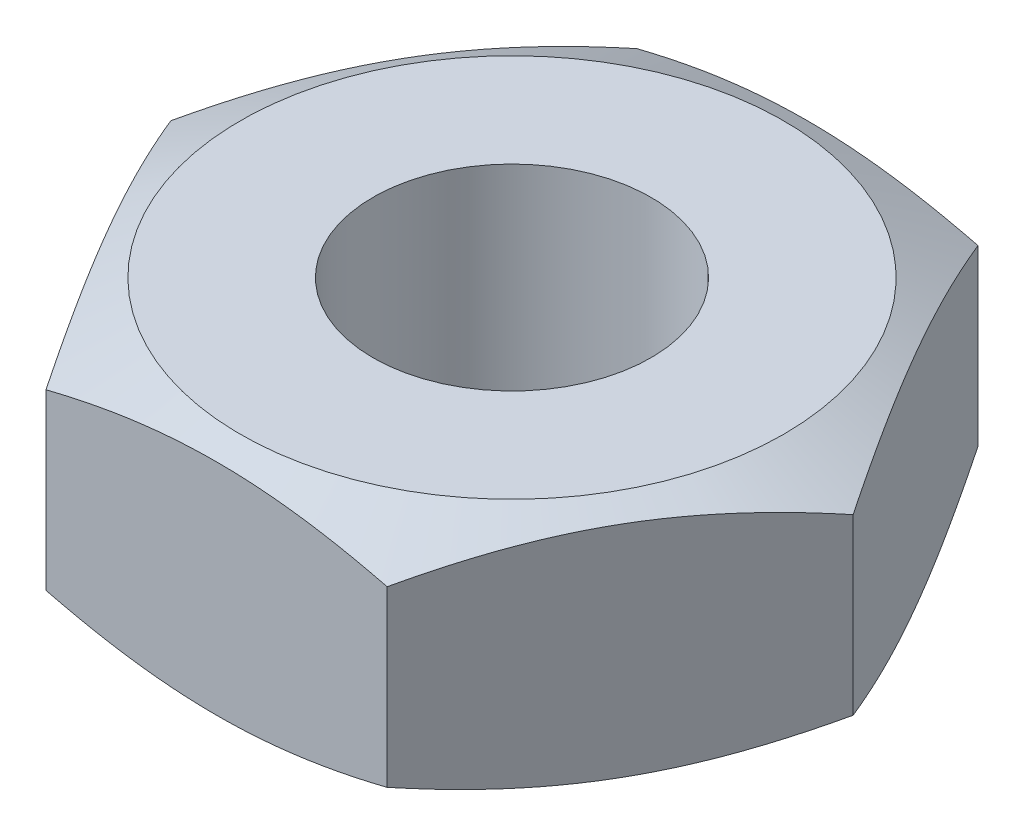
ISO-10303-21;
HEADER;
FILE_DESCRIPTION(('STEP AP214'),'2;1');
FILE_NAME('part.step','',(''),(''),'','','');
FILE_SCHEMA(('AUTOMOTIVE_DESIGN { 1 0 10303 214 1 1 1 1 }'));
ENDSEC;
DATA;
#1=APPLICATION_CONTEXT('core data for automotive mechanical design processes');
#2=APPLICATION_PROTOCOL_DEFINITION('international standard','automotive_design',2000,#1);
#3=PRODUCT_CONTEXT('',#1,'mechanical');
#4=PRODUCT('Part','Part','',(#3));
#5=PRODUCT_RELATED_PRODUCT_CATEGORY('part','',(#4));
#6=PRODUCT_DEFINITION_FORMATION('','',#4);
#7=PRODUCT_DEFINITION_CONTEXT('part definition',#1,'design');
#8=PRODUCT_DEFINITION('design','',#6,#7);
#9=PRODUCT_DEFINITION_SHAPE('','',#8);
#10=(LENGTH_UNIT() NAMED_UNIT(*) SI_UNIT(.MILLI.,.METRE.));
#11=(NAMED_UNIT(*) PLANE_ANGLE_UNIT() SI_UNIT($,.RADIAN.));
#12=(NAMED_UNIT(*) SI_UNIT($,.STERADIAN.) SOLID_ANGLE_UNIT());
#13=UNCERTAINTY_MEASURE_WITH_UNIT(LENGTH_MEASURE(1.E-05),#10,'distance_accuracy_value','');
#14=(GEOMETRIC_REPRESENTATION_CONTEXT(3) GLOBAL_UNCERTAINTY_ASSIGNED_CONTEXT((#13)) GLOBAL_UNIT_ASSIGNED_CONTEXT((#10,
#11,#12)) REPRESENTATION_CONTEXT('',''));
#15=CARTESIAN_POINT('',(0.,0.,0.));
#16=DIRECTION('',(0.,0.,1.));
#17=DIRECTION('',(1.,0.,0.));
#18=AXIS2_PLACEMENT_3D('',#15,#16,#17);
#19=CARTESIAN_POINT('',(0.,3.5,0.));
#20=DIRECTION('',(0.,1.,0.));
#21=DIRECTION('',(0.,0.,1.));
#22=AXIS2_PLACEMENT_3D('',#19,#20,#21);
#23=PLANE('',#22);
#24=CARTESIAN_POINT('',(0.,3.5,0.));
#25=DIRECTION('',(0.,1.,0.));
#26=DIRECTION('',(0.,0.,1.));
#27=AXIS2_PLACEMENT_3D('',#24,#25,#26);
#28=CIRCLE('',#27,2.);
#29=CARTESIAN_POINT('',(0.,3.5,2.));
#30=VERTEX_POINT('',#29);
#31=EDGE_CURVE('E114',#30,#30,#28,.T.);
#32=ORIENTED_EDGE('',*,*,#31,.F.);
#33=EDGE_LOOP('',(#32));
#34=FACE_BOUND('',#33,.T.);
#35=CARTESIAN_POINT('',(0.,3.50000000000006,0.));
#36=DIRECTION('',(0.,-1.,0.));
#37=DIRECTION('',(1.,0.,0.));
#38=AXIS2_PLACEMENT_3D('',#35,#36,#37);
#39=CIRCLE('',#38,3.90747728811183);
#40=CARTESIAN_POINT('',(3.90747728811182,3.50000000000007,0.));
#41=VERTEX_POINT('',#40);
#42=EDGE_CURVE('E107',#41,#41,#39,.T.);
#43=ORIENTED_EDGE('',*,*,#42,.F.);
#44=EDGE_LOOP('',(#43));
#45=FACE_BOUND('',#44,.T.);
#46=ADVANCED_FACE('F34',(#34,#45),#23,.T.);
#47=CARTESIAN_POINT('',(0.,0.,0.));
#48=DIRECTION('',(0.,1.,0.));
#49=DIRECTION('',(0.,0.,1.));
#50=AXIS2_PLACEMENT_3D('',#47,#48,#49);
#51=PLANE('',#50);
#52=CARTESIAN_POINT('',(0.,0.,0.));
#53=DIRECTION('',(0.,-1.,0.));
#54=DIRECTION('',(1.,0.,0.));
#55=AXIS2_PLACEMENT_3D('',#52,#53,#54);
#56=CIRCLE('',#55,3.90747728811182);
#57=CARTESIAN_POINT('',(3.90747728811182,0.,0.));
#58=VERTEX_POINT('',#57);
#59=EDGE_CURVE('E227',#58,#58,#56,.T.);
#60=ORIENTED_EDGE('',*,*,#59,.T.);
#61=EDGE_LOOP('',(#60));
#62=FACE_BOUND('',#61,.T.);
#63=CARTESIAN_POINT('',(0.,0.,0.));
#64=DIRECTION('',(0.,1.,0.));
#65=DIRECTION('',(0.,0.,1.));
#66=AXIS2_PLACEMENT_3D('',#63,#64,#65);
#67=CIRCLE('',#66,2.);
#68=CARTESIAN_POINT('',(0.,0.,2.));
#69=VERTEX_POINT('',#68);
#70=EDGE_CURVE('E205',#69,#69,#67,.T.);
#71=ORIENTED_EDGE('',*,*,#70,.T.);
#72=EDGE_LOOP('',(#71));
#73=FACE_BOUND('',#72,.T.);
#74=ADVANCED_FACE('F210',(#62,#73),#51,.F.);
#75=CARTESIAN_POINT('',(0.,3.5,0.));
#76=DIRECTION('',(0.,-1.,0.));
#77=DIRECTION('',(0.,0.,-1.));
#78=AXIS2_PLACEMENT_3D('',#75,#76,#77);
#79=CYLINDRICAL_SURFACE('',#78,2.);
#80=ORIENTED_EDGE('',*,*,#31,.T.);
#81=EDGE_LOOP('',(#80));
#82=FACE_BOUND('',#81,.T.);
#83=ORIENTED_EDGE('',*,*,#70,.F.);
#84=EDGE_LOOP('',(#83));
#85=FACE_BOUND('',#84,.T.);
#86=ADVANCED_FACE('F136',(#82,#85),#79,.F.);
#87=CARTESIAN_POINT('',(0.,0.499999999999945,0.));
#88=DIRECTION('',(0.,1.,0.));
#89=DIRECTION('',(-1.,0.,0.));
#90=AXIS2_PLACEMENT_3D('',#87,#88,#89);
#91=CONICAL_SURFACE('',#90,4.90747728811182,1.10714871779414);
#92=ORIENTED_EDGE('',*,*,#59,.F.);
#93=EDGE_LOOP('',(#92));
#94=FACE_BOUND('',#93,.T.);
#95=CARTESIAN_POINT('',(2.45362317400207,0.500057737064531,4.2502));
#96=CARTESIAN_POINT('',(2.52278295562573,0.465477965744529,4.13041174438745));
#97=CARTESIAN_POINT('',(2.59221217998296,0.432950219492831,4.01015680027063));
#98=CARTESIAN_POINT('',(2.73162364666741,0.372683746213461,3.76868905681548));
#99=CARTESIAN_POINT('',(2.8016061545201,0.344947485502717,3.64747579757354));
#100=CARTESIAN_POINT('',(2.94217126125154,0.29494890287976,3.40400989094333));
#101=CARTESIAN_POINT('',(3.01275459514275,0.272694745517887,3.28175597047616));
#102=CARTESIAN_POINT('',(3.1543331879412,0.234399523783582,3.03653465448514));
#103=CARTESIAN_POINT('',(3.22532837370295,0.218357388483804,2.91356738565299));
#104=CARTESIAN_POINT('',(3.36600994554199,0.193332945594494,2.66989975553912));
#105=CARTESIAN_POINT('',(3.43568951078214,0.184198820156283,2.54921120829388));
#106=CARTESIAN_POINT('',(3.57519371511526,0.172738623577756,2.30758283851944));
#107=CARTESIAN_POINT('',(3.64501836119307,0.170412888197534,2.18664300389216));
#108=CARTESIAN_POINT('',(3.78456417962469,0.172659669068327,1.94494255638481));
#109=CARTESIAN_POINT('',(3.85428538239603,0.177224753898704,1.82418189082003));
#110=CARTESIAN_POINT('',(3.99352909561335,0.19306351315432,1.58300470489309));
#111=CARTESIAN_POINT('',(4.06305162249021,0.204336615672373,1.46258815607179));
#112=CARTESIAN_POINT('',(4.19740589716131,0.232276061932169,1.22987972612738));
#113=CARTESIAN_POINT('',(4.26225786933517,0.248558963177629,1.11755281535122));
#114=CARTESIAN_POINT('',(4.39159748259917,0.286194794954918,0.89353003374666));
#115=CARTESIAN_POINT('',(4.45608508403609,0.307548266819627,0.781834231599657));
#116=CARTESIAN_POINT('',(4.58535586902322,0.355057116819232,0.557930664067651));
#117=CARTESIAN_POINT('',(4.65013432856287,0.38126339092329,0.445731080908923));
#118=CARTESIAN_POINT('',(4.77921587468691,0.437746320680366,0.222155284702533));
#119=CARTESIAN_POINT('',(4.84351916885742,0.468021072568312,0.110778712105161));
#120=CARTESIAN_POINT('',(4.90759275816566,0.500057737064539,-0.000199999999999661));
#121=B_SPLINE_CURVE_WITH_KNOTS('',3,(#95,#96,#97,#98,#99,#100,#101,#102,#103,#104,#105,#106,
#107,#108,#109,#110,#111,#112,#113,#114,#115,#116,#117,#118,#119,#120),.UNSPECIFIED.,.F.,.F.,(4,
2,2,2,2,2,2,2,2,2,2,2,4),(0.,0.427751397409062,0.855722319078569,1.28432682006899,
1.71285739845528,2.1316721010384,2.55050745738751,2.96889144240426,3.38723976225998,
3.77929813681134,4.171398386252,4.56787140836849,4.96415955046952),.UNSPECIFIED.);
#122=CARTESIAN_POINT('',(2.45373864405077,0.499999999999953,4.25000000000297));
#123=VERTEX_POINT('',#122);
#124=CARTESIAN_POINT('',(4.90747728811182,0.499999999999945,0.));
#125=VERTEX_POINT('',#124);
#126=EDGE_CURVE('E49',#123,#125,#121,.T.);
#127=ORIENTED_EDGE('',*,*,#126,.F.);
#128=CARTESIAN_POINT('',(-7.38682150637215,2.30735370318888,4.25));
#129=CARTESIAN_POINT('',(-7.17846683970291,2.21707850150756,4.25));
#130=CARTESIAN_POINT('',(-6.96977741587598,2.1275639121507,4.25));
#131=CARTESIAN_POINT('',(-6.55153788356649,1.95050773790513,4.25));
#132=CARTESIAN_POINT('',(-6.34198768572352,1.86296636431414,4.25));
#133=CARTESIAN_POINT('',(-5.92121413946108,1.69005430547638,4.25));
#134=CARTESIAN_POINT('',(-5.70998759328905,1.60469137795696,4.25));
#135=CARTESIAN_POINT('',(-5.28630486237318,1.43708395148798,4.25));
#136=CARTESIAN_POINT('',(-5.0738487172705,1.35483935264474,4.25));
#137=CARTESIAN_POINT('',(-4.64754050312009,1.19437385007235,4.25));
#138=CARTESIAN_POINT('',(-4.43368921365345,1.11615088539154,4.25));
#139=CARTESIAN_POINT('',(-4.00415078881142,0.964842914858277,4.25));
#140=CARTESIAN_POINT('',(-3.78846353186067,0.891758252271755,4.25));
#141=CARTESIAN_POINT('',(-3.35507412440195,0.752343744460752,4.25));
#142=CARTESIAN_POINT('',(-3.13737365255864,0.686008743295674,4.25));
#143=CARTESIAN_POINT('',(-2.69953009519539,0.562080023025934,4.25));
#144=CARTESIAN_POINT('',(-2.47938741206837,0.50448488618763,4.25));
#145=CARTESIAN_POINT('',(-1.96341483218415,0.383463604318841,4.25));
#146=CARTESIAN_POINT('',(-1.6665187156495,0.324356183874746,4.25));
#147=CARTESIAN_POINT('',(-1.21824049085435,0.255694068630331,4.25));
#148=CARTESIAN_POINT('',(-1.0683719170784,0.236142805436791,4.25));
#149=CARTESIAN_POINT('',(-0.767843048994607,0.204416400107741,4.25));
#150=CARTESIAN_POINT('',(-0.617182771100091,0.192241105660051,4.25));
#151=CARTESIAN_POINT('',(-0.315637281091605,0.175797750290819,4.25));
#152=CARTESIAN_POINT('',(-0.164752674268112,0.17151870300025,4.25));
#153=CARTESIAN_POINT('',(0.137029002793724,0.171026614767616,4.25));
#154=CARTESIAN_POINT('',(0.287926072942384,0.174813520115606,4.25));
#155=CARTESIAN_POINT('',(0.589355783091948,0.190285212285016,4.25));
#156=CARTESIAN_POINT('',(0.739888299421069,0.201972381346639,4.25));
#157=CARTESIAN_POINT('',(1.04018674402336,0.232746409670686,4.25));
#158=CARTESIAN_POINT('',(1.18995264133586,0.251833565436861,4.25));
#159=CARTESIAN_POINT('',(1.59966743409081,0.313405656147729,4.25));
#160=CARTESIAN_POINT('',(1.85859475757846,0.362728797883641,4.25));
#161=CARTESIAN_POINT('',(2.3729161763417,0.477311280325341,4.25));
#162=CARTESIAN_POINT('',(2.62830834522692,0.542578974269532,4.25));
#163=CARTESIAN_POINT('',(3.13664303492203,0.685230094850543,4.25));
#164=CARTESIAN_POINT('',(3.3895732047964,0.762656893962579,4.25));
#165=CARTESIAN_POINT('',(3.89250250616495,0.926262575007523,4.25));
#166=CARTESIAN_POINT('',(4.1425021350293,1.0124399470868,4.25));
#167=CARTESIAN_POINT('',(4.64583349617743,1.19328218037686,4.25));
#168=CARTESIAN_POINT('',(4.89911143648236,1.28809564710719,4.25));
#169=CARTESIAN_POINT('',(5.40374564348319,1.48272894496077,4.25));
#170=CARTESIAN_POINT('',(5.65510177508946,1.58254912435914,4.25));
#171=CARTESIAN_POINT('',(6.15388121537087,1.78496634969979,4.25));
#172=CARTESIAN_POINT('',(6.40131912317866,1.88752758578269,4.25));
#173=CARTESIAN_POINT('',(6.89493111985421,2.09550002605385,4.25));
#174=CARTESIAN_POINT('',(7.14110547839045,2.2009105892432,4.25));
#175=CARTESIAN_POINT('',(7.38682150637215,2.30735370318894,4.25));
#176=B_SPLINE_CURVE_WITH_KNOTS('',3,(#128,#129,#130,#131,#132,#133,#134,#135,#136,#137,#138,
#139,#140,#141,#142,#143,#144,#145,#146,#147,#148,#149,#150,#151,#152,#153,#154,#155,#156,#157,
#158,#159,#160,#161,#162,#163,#164,#165,#166,#167,#168,#169,#170,#171,#172,#173,#174,#175),
.UNSPECIFIED.,.F.,.F.,(4,2,2,2,2,2,2,2,2,2,2,2,2,2,2,2,2,2,2,2,2,2,2,4),(0.,0.681218887506,
1.36251037866221,2.045960801668,2.7293893122428,3.41246402448426,4.09558432647642,
4.77817882503235,5.46066247815301,6.36774647698379,6.82100995852951,7.27426407996198,
7.72688709368008,8.17950709346026,8.63226363688856,9.08503832330751,9.87506636578144,
10.6655091893226,11.4588384588752,12.252031076548,13.0632892144357,13.8746038632438,
14.6781381019365,15.4814930537753),.UNSPECIFIED.);
#177=CARTESIAN_POINT('',(-2.45373864405591,0.499999999999936,4.25));
#178=VERTEX_POINT('',#177);
#179=EDGE_CURVE('E92',#178,#123,#176,.T.);
#180=ORIENTED_EDGE('',*,*,#179,.F.);
#181=CARTESIAN_POINT('',(-4.90759275816566,0.500057737064503,-0.00020000000000005));
#182=CARTESIAN_POINT('',(-4.83843297654199,0.4654779657445,0.119588255612549));
#183=CARTESIAN_POINT('',(-4.76900375218476,0.432950219492802,0.239843199729372));
#184=CARTESIAN_POINT('',(-4.62959228550032,0.372683746213433,0.48131094318452));
#185=CARTESIAN_POINT('',(-4.55960977764763,0.344947485502689,0.602524202426467));
#186=CARTESIAN_POINT('',(-4.41904467091619,0.294948902879732,0.845990109056673));
#187=CARTESIAN_POINT('',(-4.34846133702498,0.272694745517859,0.968244029523844));
#188=CARTESIAN_POINT('',(-4.20688274422653,0.234399523783554,1.21346534551486));
#189=CARTESIAN_POINT('',(-4.13588755846477,0.218357388483776,1.33643261434701));
#190=CARTESIAN_POINT('',(-3.99520598662573,0.193332945594467,1.58010024446088));
#191=CARTESIAN_POINT('',(-3.92552642138559,0.184198820156256,1.70078879170613));
#192=CARTESIAN_POINT('',(-3.78602221705246,0.172738623577729,1.94241716148056));
#193=CARTESIAN_POINT('',(-3.71619757097466,0.170412888197507,2.06335699610784));
#194=CARTESIAN_POINT('',(-3.57665175254304,0.1726596690683,2.30505744361519));
#195=CARTESIAN_POINT('',(-3.50693054977169,0.177224753898677,2.42581810917997));
#196=CARTESIAN_POINT('',(-3.36768683655438,0.193063513154293,2.66699529510691));
#197=CARTESIAN_POINT('',(-3.29816430967751,0.204336615672347,2.78741184392821));
#198=CARTESIAN_POINT('',(-3.16381003500641,0.232276061932143,3.02012027387262));
#199=CARTESIAN_POINT('',(-3.09895806283256,0.248558963177602,3.13244718464878));
#200=CARTESIAN_POINT('',(-2.96961844956855,0.286194794954892,3.35646996625334));
#201=CARTESIAN_POINT('',(-2.90513084813163,0.307548266819601,3.46816576840035));
#202=CARTESIAN_POINT('',(-2.77586006314451,0.355057116819205,3.69206933593235));
#203=CARTESIAN_POINT('',(-2.71108160360486,0.381263390923264,3.80426891909108));
#204=CARTESIAN_POINT('',(-2.58200005748081,0.43774632068034,4.02784471529747));
#205=CARTESIAN_POINT('',(-2.5176967633103,0.468021072568285,4.13922128789484));
#206=CARTESIAN_POINT('',(-2.45362317400207,0.500057737064513,4.2502));
#207=B_SPLINE_CURVE_WITH_KNOTS('',3,(#181,#182,#183,#184,#185,#186,#187,#188,#189,#190,#191,
#192,#193,#194,#195,#196,#197,#198,#199,#200,#201,#202,#203,#204,#205,#206),.UNSPECIFIED.,.F.,
.F.,(4,2,2,2,2,2,2,2,2,2,2,2,4),(0.,0.427751397409062,0.85572231907857,1.284326820069,
1.71285739845528,2.13167210103841,2.55050745738751,2.96889144240427,3.38723976225999,
3.77929813681135,4.17139838625201,4.5678714083685,4.96415955046952),.UNSPECIFIED.);
#208=CARTESIAN_POINT('',(-4.90747728811182,0.499999999999928,5.93535637305465E-12));
#209=VERTEX_POINT('',#208);
#210=EDGE_CURVE('E106',#209,#178,#207,.T.);
#211=ORIENTED_EDGE('',*,*,#210,.F.);
#212=CARTESIAN_POINT('',(-2.45362317400207,0.500057737064513,-4.2502));
#213=CARTESIAN_POINT('',(-2.52278295562573,0.465477965744509,-4.13041174438745));
#214=CARTESIAN_POINT('',(-2.59221217998296,0.432950219492811,-4.01015680027063));
#215=CARTESIAN_POINT('',(-2.7316236466674,0.372683746213441,-3.76868905681548));
#216=CARTESIAN_POINT('',(-2.80160615452009,0.344947485502696,-3.64747579757353));
#217=CARTESIAN_POINT('',(-2.94217126125154,0.294948902879738,-3.40400989094333));
#218=CARTESIAN_POINT('',(-3.01275459514275,0.272694745517864,-3.28175597047615));
#219=CARTESIAN_POINT('',(-3.1543331879412,0.234399523783558,-3.03653465448514));
#220=CARTESIAN_POINT('',(-3.22532837370295,0.21835738848378,-2.91356738565298));
#221=CARTESIAN_POINT('',(-3.36600994554199,0.193332945594469,-2.66989975553911));
#222=CARTESIAN_POINT('',(-3.43568951078214,0.184198820156258,-2.54921120829387));
#223=CARTESIAN_POINT('',(-3.57519371511526,0.172738623577731,-2.30758283851943));
#224=CARTESIAN_POINT('',(-3.64501836119307,0.170412888197508,-2.18664300389216));
#225=CARTESIAN_POINT('',(-3.78456417962469,0.1726596690683,-1.94494255638481));
#226=CARTESIAN_POINT('',(-3.85428538239603,0.177224753898677,-1.82418189082003));
#227=CARTESIAN_POINT('',(-3.99352909561335,0.193063513154292,-1.58300470489309));
#228=CARTESIAN_POINT('',(-4.06305162249021,0.204336615672345,-1.46258815607179));
#229=CARTESIAN_POINT('',(-4.19740589716131,0.232276061932139,-1.22987972612738));
#230=CARTESIAN_POINT('',(-4.26225786933517,0.248558963177599,-1.11755281535122));
#231=CARTESIAN_POINT('',(-4.39159748259917,0.286194794954887,-0.893530033746655));
#232=CARTESIAN_POINT('',(-4.45608508403609,0.307548266819596,-0.781834231599652));
#233=CARTESIAN_POINT('',(-4.58535586902321,0.355057116819199,-0.557930664067648));
#234=CARTESIAN_POINT('',(-4.65013432856287,0.381263390923257,-0.445731080908921));
#235=CARTESIAN_POINT('',(-4.77921587468691,0.437746320680331,-0.222155284702533));
#236=CARTESIAN_POINT('',(-4.84351916885742,0.468021072568276,-0.110778712105161));
#237=CARTESIAN_POINT('',(-4.90759275816565,0.500057737064503,0.000199999999999694));
#238=B_SPLINE_CURVE_WITH_KNOTS('',3,(#212,#213,#214,#215,#216,#217,#218,#219,#220,#221,#222,
#223,#224,#225,#226,#227,#228,#229,#230,#231,#232,#233,#234,#235,#236,#237),.UNSPECIFIED.,.F.,
.F.,(4,2,2,2,2,2,2,2,2,2,2,2,4),(0.,0.427751397409063,0.855722319078571,1.284326820069,
1.71285739845528,2.13167210103841,2.55050745738752,2.96889144240427,3.38723976225999,
3.77929813681135,4.171398386252,4.5678714083685,4.96415955046952),.UNSPECIFIED.);
#239=CARTESIAN_POINT('',(-2.45373864406106,0.499999999999936,-4.24999999999703));
#240=VERTEX_POINT('',#239);
#241=EDGE_CURVE('E158',#240,#209,#238,.T.);
#242=ORIENTED_EDGE('',*,*,#241,.F.);
#243=CARTESIAN_POINT('',(7.38682150637216,2.30735370318894,-4.25));
#244=CARTESIAN_POINT('',(7.17846683970292,2.21707850150762,-4.25));
#245=CARTESIAN_POINT('',(6.96977741587599,2.12756391215076,-4.25));
#246=CARTESIAN_POINT('',(6.5515378835665,1.95050773790519,-4.25));
#247=CARTESIAN_POINT('',(6.34198768572353,1.8629663643142,-4.25));
#248=CARTESIAN_POINT('',(5.92121413946109,1.69005430547642,-4.25));
#249=CARTESIAN_POINT('',(5.70998759328906,1.604691377957,-4.25));
#250=CARTESIAN_POINT('',(5.28630486237319,1.43708395148802,-4.25));
#251=CARTESIAN_POINT('',(5.07384871727051,1.35483935264478,-4.25));
#252=CARTESIAN_POINT('',(4.6475405031201,1.19437385007239,-4.25));
#253=CARTESIAN_POINT('',(4.43368921365346,1.11615088539157,-4.25));
#254=CARTESIAN_POINT('',(4.00415078881143,0.96484291485831,-4.25));
#255=CARTESIAN_POINT('',(3.78846353186068,0.891758252271786,-4.25));
#256=CARTESIAN_POINT('',(3.35507412440196,0.752343744460779,-4.25));
#257=CARTESIAN_POINT('',(3.13737365255865,0.686008743295699,-4.25));
#258=CARTESIAN_POINT('',(2.6995300951954,0.562080023025955,-4.25));
#259=CARTESIAN_POINT('',(2.47938741206838,0.504484886187649,-4.25));
#260=CARTESIAN_POINT('',(1.96341483218416,0.383463604318856,-4.25));
#261=CARTESIAN_POINT('',(1.66651871564951,0.324356183874758,-4.25));
#262=CARTESIAN_POINT('',(1.21824049085436,0.255694068630339,-4.25));
#263=CARTESIAN_POINT('',(1.06837191707841,0.236142805436798,-4.25));
#264=CARTESIAN_POINT('',(0.767843048994617,0.204416400107746,-4.25));
#265=CARTESIAN_POINT('',(0.6171827711001,0.192241105660055,-4.25));
#266=CARTESIAN_POINT('',(0.315637281091614,0.17579775029082,-4.25));
#267=CARTESIAN_POINT('',(0.164752674268121,0.171518703000251,-4.25));
#268=CARTESIAN_POINT('',(-0.137029002793715,0.171026614767614,-4.25));
#269=CARTESIAN_POINT('',(-0.287926072942375,0.174813520115602,-4.25));
#270=CARTESIAN_POINT('',(-0.589355783091939,0.19028521228501,-4.25));
#271=CARTESIAN_POINT('',(-0.73988829942106,0.201972381346632,-4.25));
#272=CARTESIAN_POINT('',(-1.04018674402335,0.232746409670677,-4.25));
#273=CARTESIAN_POINT('',(-1.18995264133585,0.25183356543685,-4.25));
#274=CARTESIAN_POINT('',(-1.59966743409081,0.313405656147715,-4.25));
#275=CARTESIAN_POINT('',(-1.85859475757845,0.362728797883625,-4.25));
#276=CARTESIAN_POINT('',(-2.3729161763417,0.477311280325321,-4.25));
#277=CARTESIAN_POINT('',(-2.62830834522691,0.54257897426951,-4.25));
#278=CARTESIAN_POINT('',(-3.13664303492202,0.685230094850517,-4.25));
#279=CARTESIAN_POINT('',(-3.38957320479639,0.762656893962551,-4.25));
#280=CARTESIAN_POINT('',(-3.89250250616494,0.926262575007492,-4.25));
#281=CARTESIAN_POINT('',(-4.14250213502929,1.01243994708677,-4.25));
#282=CARTESIAN_POINT('',(-4.64583349617743,1.19328218037683,-4.25));
#283=CARTESIAN_POINT('',(-4.89911143648235,1.28809564710715,-4.25));
#284=CARTESIAN_POINT('',(-5.40374564348318,1.48272894496073,-4.25));
#285=CARTESIAN_POINT('',(-5.65510177508946,1.5825491243591,-4.25));
#286=CARTESIAN_POINT('',(-6.15388121537087,1.78496634969975,-4.25));
#287=CARTESIAN_POINT('',(-6.40131912317866,1.88752758578264,-4.25));
#288=CARTESIAN_POINT('',(-6.89493111985421,2.09550002605379,-4.25));
#289=CARTESIAN_POINT('',(-7.14110547839046,2.20091058924314,-4.25));
#290=CARTESIAN_POINT('',(-7.38682150637215,2.30735370318888,-4.25));
#291=B_SPLINE_CURVE_WITH_KNOTS('',3,(#243,#244,#245,#246,#247,#248,#249,#250,#251,#252,#253,
#254,#255,#256,#257,#258,#259,#260,#261,#262,#263,#264,#265,#266,#267,#268,#269,#270,#271,#272,
#273,#274,#275,#276,#277,#278,#279,#280,#281,#282,#283,#284,#285,#286,#287,#288,#289,#290),
.UNSPECIFIED.,.F.,.F.,(4,2,2,2,2,2,2,2,2,2,2,2,2,2,2,2,2,2,2,2,2,2,2,4),(0.,0.681218887506,
1.36251037866222,2.045960801668,2.7293893122428,3.41246402448427,4.09558432647643,
4.77817882503237,5.46066247815303,6.3677464769838,6.82100995852953,7.27426407996199,
7.7268870936801,8.17950709346027,8.63226363688858,9.08503832330752,9.87506636578145,
10.6655091893226,11.4588384588752,12.2520310765481,13.0632892144357,13.8746038632438,
14.6781381019365,15.4814930537753),.UNSPECIFIED.);
#292=CARTESIAN_POINT('',(2.45373864405591,0.499999999999953,-4.25));
#293=VERTEX_POINT('',#292);
#294=EDGE_CURVE('E165',#293,#240,#291,.T.);
#295=ORIENTED_EDGE('',*,*,#294,.F.);
#296=CARTESIAN_POINT('',(4.90759275816566,0.500057737064539,0.00020000000000006));
#297=CARTESIAN_POINT('',(4.838432976542,0.465477965744536,-0.119588255612549));
#298=CARTESIAN_POINT('',(4.76900375218477,0.432950219492837,-0.239843199729371));
#299=CARTESIAN_POINT('',(4.62959228550032,0.372683746213468,-0.481310943184519));
#300=CARTESIAN_POINT('',(4.55960977764763,0.344947485502723,-0.602524202426466));
#301=CARTESIAN_POINT('',(4.41904467091619,0.294948902879765,-0.845990109056672));
#302=CARTESIAN_POINT('',(4.34846133702498,0.272694745517891,-0.968244029523842));
#303=CARTESIAN_POINT('',(4.20688274422653,0.234399523783585,-1.21346534551486));
#304=CARTESIAN_POINT('',(4.13588755846478,0.218357388483807,-1.33643261434701));
#305=CARTESIAN_POINT('',(3.99520598662574,0.193332945594496,-1.58010024446088));
#306=CARTESIAN_POINT('',(3.92552642138559,0.184198820156285,-1.70078879170612));
#307=CARTESIAN_POINT('',(3.78602221705247,0.172738623577757,-1.94241716148056));
#308=CARTESIAN_POINT('',(3.71619757097466,0.170412888197534,-2.06335699610784));
#309=CARTESIAN_POINT('',(3.57665175254304,0.172659669068326,-2.30505744361519));
#310=CARTESIAN_POINT('',(3.5069305497717,0.177224753898703,-2.42581810917996));
#311=CARTESIAN_POINT('',(3.36768683655438,0.193063513154318,-2.6669952951069));
#312=CARTESIAN_POINT('',(3.29816430967752,0.20433661567237,-2.78741184392821));
#313=CARTESIAN_POINT('',(3.16381003500642,0.232276061932165,-3.02012027387262));
#314=CARTESIAN_POINT('',(3.09895806283256,0.248558963177624,-3.13244718464878));
#315=CARTESIAN_POINT('',(2.96961844956856,0.286194794954913,-3.35646996625334));
#316=CARTESIAN_POINT('',(2.90513084813164,0.307548266819622,-3.46816576840034));
#317=CARTESIAN_POINT('',(2.77586006314452,0.355057116819225,-3.69206933593235));
#318=CARTESIAN_POINT('',(2.71108160360486,0.381263390923283,-3.80426891909108));
#319=CARTESIAN_POINT('',(2.58200005748082,0.437746320680358,-4.02784471529747));
#320=CARTESIAN_POINT('',(2.51769676331031,0.468021072568303,-4.13922128789484));
#321=CARTESIAN_POINT('',(2.45362317400207,0.50005773706453,-4.2502));
#322=B_SPLINE_CURVE_WITH_KNOTS('',3,(#296,#297,#298,#299,#300,#301,#302,#303,#304,#305,#306,
#307,#308,#309,#310,#311,#312,#313,#314,#315,#316,#317,#318,#319,#320,#321),.UNSPECIFIED.,.F.,
.F.,(4,2,2,2,2,2,2,2,2,2,2,2,4),(0.,0.427751397409062,0.855722319078569,1.28432682006899,
1.71285739845528,2.1316721010384,2.55050745738751,2.96889144240426,3.38723976225998,
3.77929813681134,4.171398386252,4.56787140836849,4.96415955046952),.UNSPECIFIED.);
#323=EDGE_CURVE('E63',#125,#293,#322,.T.);
#324=ORIENTED_EDGE('',*,*,#323,.F.);
#325=EDGE_LOOP('',(#127,#180,#211,#242,#295,#324));
#326=FACE_BOUND('',#325,.T.);
#327=ADVANCED_FACE('F91',(#94,#326),#91,.T.);
#328=CARTESIAN_POINT('',(0.,3.50000000000006,0.));
#329=DIRECTION('',(0.,-1.,0.));
#330=DIRECTION('',(1.,0.,0.));
#331=AXIS2_PLACEMENT_3D('',#328,#329,#330);
#332=CONICAL_SURFACE('',#331,3.90747728811183,1.10714871779396);
#333=ORIENTED_EDGE('',*,*,#42,.T.);
#334=EDGE_LOOP('',(#333));
#335=FACE_BOUND('',#334,.T.);
#336=CARTESIAN_POINT('',(-7.38682150637217,1.1926462968101,-4.25));
#337=CARTESIAN_POINT('',(-7.17846683970303,1.28292149849141,-4.25));
#338=CARTESIAN_POINT('',(-6.9697774158762,1.37243608784827,-4.25));
#339=CARTESIAN_POINT('',(-6.5515378835669,1.54949226209384,-4.25));
#340=CARTESIAN_POINT('',(-6.34198768572403,1.63703363568483,-4.25));
#341=CARTESIAN_POINT('',(-5.92121413946179,1.8099456945226,-4.25));
#342=CARTESIAN_POINT('',(-5.70998759328986,1.89530862204202,-4.25));
#343=CARTESIAN_POINT('',(-5.28630486237419,2.06291604851101,-4.25));
#344=CARTESIAN_POINT('',(-5.07384871727161,2.14516064735426,-4.25));
#345=CARTESIAN_POINT('',(-4.64754050312139,2.30562614992667,-4.25));
#346=CARTESIAN_POINT('',(-4.43368921365484,2.38384911460749,-4.25));
#347=CARTESIAN_POINT('',(-4.004150788813,2.53515708514079,-4.25));
#348=CARTESIAN_POINT('',(-3.78846353186233,2.60824174772733,-4.25));
#349=CARTESIAN_POINT('',(-3.3550741244038,2.74765625553838,-4.25));
#350=CARTESIAN_POINT('',(-3.13737365256058,2.81399125670349,-4.25));
#351=CARTESIAN_POINT('',(-2.69953009519751,2.93791997697329,-4.25));
#352=CARTESIAN_POINT('',(-2.47938741207058,2.99551511381163,-4.25));
#353=CARTESIAN_POINT('',(-1.96341483218669,3.1165363956805,-4.25));
#354=CARTESIAN_POINT('',(-1.66651871565227,3.17564381612465,-4.25));
#355=CARTESIAN_POINT('',(-1.21824049085746,3.24430593136918,-4.25));
#356=CARTESIAN_POINT('',(-1.06837191708162,3.26385719456277,-4.25));
#357=CARTESIAN_POINT('',(-0.767843048998052,3.29558359989192,-4.25));
#358=CARTESIAN_POINT('',(-0.617182771103647,3.30775889433967,-4.25));
#359=CARTESIAN_POINT('',(-0.315637281095382,3.32420224970902,-4.25));
#360=CARTESIAN_POINT('',(-0.164752674271999,3.32848129699966,-4.25));
#361=CARTESIAN_POINT('',(0.13702900278962,3.32897338523244,-4.25));
#362=CARTESIAN_POINT('',(0.287926072938175,3.32518647988452,-4.25));
#363=CARTESIAN_POINT('',(0.589355783087529,3.30971478771527,-4.25));
#364=CARTESIAN_POINT('',(0.739888299416547,3.29802761865373,-4.25));
#365=CARTESIAN_POINT('',(1.04018674401863,3.26725359032984,-4.25));
#366=CARTESIAN_POINT('',(1.18995264133104,3.24816643456375,-4.25));
#367=CARTESIAN_POINT('',(1.5996674340861,3.18659434385304,-4.25));
#368=CARTESIAN_POINT('',(1.85859475757396,3.13727120211718,-4.25));
#369=CARTESIAN_POINT('',(2.37291617633762,3.02268871967553,-4.25));
#370=CARTESIAN_POINT('',(2.62830834522304,2.95742102573133,-4.25));
#371=CARTESIAN_POINT('',(3.13664303491855,2.81476990515027,-4.25));
#372=CARTESIAN_POINT('',(3.38957320479312,2.73734310603819,-4.25));
#373=CARTESIAN_POINT('',(3.89250250616206,2.57373742499313,-4.25));
#374=CARTESIAN_POINT('',(4.1425021350266,2.48756005291378,-4.25));
#375=CARTESIAN_POINT('',(4.64583349617516,2.30671781962354,-4.25));
#376=CARTESIAN_POINT('',(4.89911143648031,2.21190435289311,-4.25));
#377=CARTESIAN_POINT('',(5.40374564348158,2.0172710550393,-4.25));
#378=CARTESIAN_POINT('',(5.65510177508808,1.91745087564081,-4.25));
#379=CARTESIAN_POINT('',(6.15388121536991,1.71503365029992,-4.25));
#380=CARTESIAN_POINT('',(6.40131912317789,1.61247241421689,-4.25));
#381=CARTESIAN_POINT('',(6.89493111985384,1.40449997394549,-4.25));
#382=CARTESIAN_POINT('',(7.14110547839028,1.29908941075601,-4.25));
#383=CARTESIAN_POINT('',(7.38682150637217,1.19264629681014,-4.25));
#384=B_SPLINE_CURVE_WITH_KNOTS('',3,(#336,#337,#338,#339,#340,#341,#342,#343,#344,#345,#346,
#347,#348,#349,#350,#351,#352,#353,#354,#355,#356,#357,#358,#359,#360,#361,#362,#363,#364,#365,
#366,#367,#368,#369,#370,#371,#372,#373,#374,#375,#376,#377,#378,#379,#380,#381,#382,#383),
.UNSPECIFIED.,.F.,.F.,(4,2,2,2,2,2,2,2,2,2,2,2,2,2,2,2,2,2,2,2,2,2,2,4),(0.,0.681218887505728,
1.36251037866167,2.04596080166718,2.72938931224171,3.41246402448293,4.09558432647485,
4.77817882503054,5.46066247815097,6.3677464769811,6.8210099585265,7.27426407995865,
7.72688709367643,8.17950709345628,8.63226363688426,9.08503832330288,9.8750663657774,
10.6655091893192,11.4588384588723,12.2520310765458,13.0632892144342,13.8746038632431,
14.6781381019364,15.481493053776),.UNSPECIFIED.);
#385=CARTESIAN_POINT('',(-2.4537386440559,2.99999999999988,-4.25000000000003));
#386=VERTEX_POINT('',#385);
#387=CARTESIAN_POINT('',(2.45373864405592,2.9999999999999,-4.25));
#388=VERTEX_POINT('',#387);
#389=EDGE_CURVE('E184',#386,#388,#384,.T.);
#390=ORIENTED_EDGE('',*,*,#389,.F.);
#391=CARTESIAN_POINT('',(-4.90759275816565,2.99994226293531,0.000199999999999695));
#392=CARTESIAN_POINT('',(-4.83843297654203,3.03452203425531,-0.119588255612496));
#393=CARTESIAN_POINT('',(-4.76900375218483,3.06704978050701,-0.239843199729263));
#394=CARTESIAN_POINT('',(-4.62959228550045,3.12731625378638,-0.481310943184301));
#395=CARTESIAN_POINT('',(-4.55960977764779,3.15505251449713,-0.602524202426194));
#396=CARTESIAN_POINT('',(-4.41904467091641,3.2050510971201,-0.845990109056291));
#397=CARTESIAN_POINT('',(-4.34846133702523,3.22730525448198,-0.968244029523407));
#398=CARTESIAN_POINT('',(-4.20688274422685,3.2656004762163,-1.21346534551431));
#399=CARTESIAN_POINT('',(-4.13588755846512,3.28164261151609,-1.33643261434641));
#400=CARTESIAN_POINT('',(-3.99520598662614,3.30666705440543,-1.58010024446018));
#401=CARTESIAN_POINT('',(-3.92552642138603,3.31580117984365,-1.70078879170536));
#402=CARTESIAN_POINT('',(-3.78602221705297,3.32726137642221,-1.94241716147969));
#403=CARTESIAN_POINT('',(-3.71619757097519,3.32958711180245,-2.06335699610692));
#404=CARTESIAN_POINT('',(-3.57665175254363,3.32734033093169,-2.30505744361416));
#405=CARTESIAN_POINT('',(-3.50693054977232,3.32277524610134,-2.42581810917889));
#406=CARTESIAN_POINT('',(-3.36768683655506,3.30693648684576,-2.66699529510572));
#407=CARTESIAN_POINT('',(-3.29816430967823,3.29566338432773,-2.78741184392697));
#408=CARTESIAN_POINT('',(-3.1638100350071,3.26772393806796,-3.02012027387144));
#409=CARTESIAN_POINT('',(-3.09895806283318,3.2514410368225,-3.13244718464771));
#410=CARTESIAN_POINT('',(-2.96961844956905,3.21380520504519,-3.35646996625249));
#411=CARTESIAN_POINT('',(-2.90513084813207,3.19245173318046,-3.4681657683996));
#412=CARTESIAN_POINT('',(-2.77586006314482,3.14494288318081,-3.69206933593182));
#413=CARTESIAN_POINT('',(-2.7110816036051,3.11873660907672,-3.80426891909065));
#414=CARTESIAN_POINT('',(-2.58200005748094,3.06225367931957,-4.02784471529726));
#415=CARTESIAN_POINT('',(-2.51769676331037,3.03197892743159,-4.13922128789473));
#416=CARTESIAN_POINT('',(-2.45362317400207,2.99994226293531,-4.2502));
#417=B_SPLINE_CURVE_WITH_KNOTS('',3,(#391,#392,#393,#394,#395,#396,#397,#398,#399,#400,#401,
#402,#403,#404,#405,#406,#407,#408,#409,#410,#411,#412,#413,#414,#415,#416),.UNSPECIFIED.,.F.,
.F.,(4,2,2,2,2,2,2,2,2,2,2,2,4),(0.,0.427751397408879,0.855722319078202,1.28432682006844,
1.71285739845455,2.13167210103749,2.55050745738641,2.96889144240298,3.38723976225852,
3.77929813681025,4.17139838625128,4.56787140836816,4.96415955046957),.UNSPECIFIED.);
#418=CARTESIAN_POINT('',(-4.90747728811184,2.99999999999987,0.));
#419=VERTEX_POINT('',#418);
#420=EDGE_CURVE('E193',#419,#386,#417,.T.);
#421=ORIENTED_EDGE('',*,*,#420,.F.);
#422=CARTESIAN_POINT('',(-2.45362317400207,2.99994226293531,4.2502));
#423=CARTESIAN_POINT('',(-2.5227829556257,3.03452203425532,4.13041174438751));
#424=CARTESIAN_POINT('',(-2.5922121799829,3.06704978050702,4.01015680027074));
#425=CARTESIAN_POINT('',(-2.73162364666728,3.12731625378639,3.7686890568157));
#426=CARTESIAN_POINT('',(-2.80160615451993,3.15505251449714,3.64747579757381));
#427=CARTESIAN_POINT('',(-2.94217126125132,3.20505109712011,3.40400989094371));
#428=CARTESIAN_POINT('',(-3.0127545951425,3.22730525448199,3.28175597047659));
#429=CARTESIAN_POINT('',(-3.15433318794088,3.26560047621631,3.03653465448569));
#430=CARTESIAN_POINT('',(-3.22532837370261,3.2816426115161,2.91356738565358));
#431=CARTESIAN_POINT('',(-3.36600994554159,3.30666705440543,2.66989975553982));
#432=CARTESIAN_POINT('',(-3.4356895107817,3.31580117984365,2.54921120829463));
#433=CARTESIAN_POINT('',(-3.57519371511476,3.32726137642221,2.3075828385203));
#434=CARTESIAN_POINT('',(-3.64501836119254,3.32958711180245,2.18664300389308));
#435=CARTESIAN_POINT('',(-3.7845641796241,3.32734033093169,1.94494255638583));
#436=CARTESIAN_POINT('',(-3.85428538239541,3.32277524610134,1.82418189082111));
#437=CARTESIAN_POINT('',(-3.99352909561267,3.30693648684576,1.58300470489427));
#438=CARTESIAN_POINT('',(-4.0630516224895,3.29566338432773,1.46258815607302));
#439=CARTESIAN_POINT('',(-4.19740589716063,3.26772393806796,1.22987972612856));
#440=CARTESIAN_POINT('',(-4.26225786933455,3.2514410368225,1.11755281535229));
#441=CARTESIAN_POINT('',(-4.39159748259868,3.21380520504518,0.893530033747509));
#442=CARTESIAN_POINT('',(-4.45608508403566,3.19245173318046,0.7818342316004));
#443=CARTESIAN_POINT('',(-4.58535586902291,3.1449428831808,0.55793066406818));
#444=CARTESIAN_POINT('',(-4.65013432856262,3.11873660907671,0.445731080909345));
#445=CARTESIAN_POINT('',(-4.77921587468679,3.06225367931957,0.222155284702743));
#446=CARTESIAN_POINT('',(-4.84351916885736,3.03197892743158,0.110778712105265));
#447=CARTESIAN_POINT('',(-4.90759275816566,2.99994226293531,-0.000200000000000037));
#448=B_SPLINE_CURVE_WITH_KNOTS('',3,(#422,#423,#424,#425,#426,#427,#428,#429,#430,#431,#432,
#433,#434,#435,#436,#437,#438,#439,#440,#441,#442,#443,#444,#445,#446,#447),.UNSPECIFIED.,.F.,
.F.,(4,2,2,2,2,2,2,2,2,2,2,2,4),(0.,0.42775139740888,0.855722319078205,1.28432682006845,
1.71285739845455,2.1316721010375,2.55050745738642,2.96889144240299,3.38723976225853,
3.77929813681026,4.17139838625129,4.56787140836817,4.96415955046957),.UNSPECIFIED.);
#449=CARTESIAN_POINT('',(-2.45373864405594,2.99999999999988,4.25));
#450=VERTEX_POINT('',#449);
#451=EDGE_CURVE('E239',#450,#419,#448,.T.);
#452=ORIENTED_EDGE('',*,*,#451,.F.);
#453=CARTESIAN_POINT('',(7.38682150637217,1.19264629681014,4.25));
#454=CARTESIAN_POINT('',(7.17846683970302,1.28292149849145,4.25));
#455=CARTESIAN_POINT('',(6.96977741587619,1.37243608784832,4.25));
#456=CARTESIAN_POINT('',(6.5515378835669,1.54949226209388,4.25));
#457=CARTESIAN_POINT('',(6.34198768572402,1.63703363568487,4.25));
#458=CARTESIAN_POINT('',(5.92121413946178,1.80994569452264,4.25));
#459=CARTESIAN_POINT('',(5.70998759328985,1.89530862204206,4.25));
#460=CARTESIAN_POINT('',(5.28630486237418,2.06291604851104,4.25));
#461=CARTESIAN_POINT('',(5.0738487172716,2.14516064735429,4.25));
#462=CARTESIAN_POINT('',(4.64754050312138,2.3056261499267,4.25));
#463=CARTESIAN_POINT('',(4.43368921365482,2.38384911460752,4.25));
#464=CARTESIAN_POINT('',(4.00415078881298,2.53515708514082,4.25));
#465=CARTESIAN_POINT('',(3.78846353186232,2.60824174772736,4.25));
#466=CARTESIAN_POINT('',(3.35507412440379,2.7476562555384,4.25));
#467=CARTESIAN_POINT('',(3.13737365256056,2.81399125670351,4.25));
#468=CARTESIAN_POINT('',(2.69953009519749,2.93791997697331,4.25));
#469=CARTESIAN_POINT('',(2.47938741207056,2.99551511381165,4.25));
#470=CARTESIAN_POINT('',(1.96341483218667,3.11653639568051,4.25));
#471=CARTESIAN_POINT('',(1.66651871565225,3.17564381612466,4.25));
#472=CARTESIAN_POINT('',(1.21824049085744,3.24430593136919,4.25));
#473=CARTESIAN_POINT('',(1.0683719170816,3.26385719456278,4.25));
#474=CARTESIAN_POINT('',(0.767843048998029,3.29558359989192,4.25));
#475=CARTESIAN_POINT('',(0.617182771103624,3.30775889433967,4.25));
#476=CARTESIAN_POINT('',(0.31563728109536,3.32420224970903,4.25));
#477=CARTESIAN_POINT('',(0.164752674271976,3.32848129699966,4.25));
#478=CARTESIAN_POINT('',(-0.137029002789643,3.32897338523244,4.25));
#479=CARTESIAN_POINT('',(-0.287926072938198,3.32518647988452,4.25));
#480=CARTESIAN_POINT('',(-0.589355783087552,3.30971478771526,4.25));
#481=CARTESIAN_POINT('',(-0.73988829941657,3.29802761865372,4.25));
#482=CARTESIAN_POINT('',(-1.04018674401866,3.26725359032983,4.25));
#483=CARTESIAN_POINT('',(-1.18995264133106,3.24816643456374,4.25));
#484=CARTESIAN_POINT('',(-1.59966743408613,3.18659434385303,4.25));
#485=CARTESIAN_POINT('',(-1.85859475757398,3.13727120211717,4.25));
#486=CARTESIAN_POINT('',(-2.37291617633764,3.02268871967551,4.25));
#487=CARTESIAN_POINT('',(-2.62830834522305,2.95742102573132,4.25));
#488=CARTESIAN_POINT('',(-3.13664303491857,2.81476990515025,4.25));
#489=CARTESIAN_POINT('',(-3.38957320479314,2.73734310603817,4.25));
#490=CARTESIAN_POINT('',(-3.89250250616207,2.5737374249931,4.25));
#491=CARTESIAN_POINT('',(-4.14250213502662,2.48756005291375,4.25));
#492=CARTESIAN_POINT('',(-4.64583349617517,2.30671781962351,4.25));
#493=CARTESIAN_POINT('',(-4.89911143648031,2.21190435289307,4.25));
#494=CARTESIAN_POINT('',(-5.40374564348159,2.01727105503927,4.25));
#495=CARTESIAN_POINT('',(-5.65510177508808,1.91745087564077,4.25));
#496=CARTESIAN_POINT('',(-6.15388121536991,1.71503365029988,4.25));
#497=CARTESIAN_POINT('',(-6.40131912317789,1.61247241421686,4.25));
#498=CARTESIAN_POINT('',(-6.89493111985383,1.40449997394545,4.25));
#499=CARTESIAN_POINT('',(-7.14110547839027,1.29908941075597,4.25));
#500=CARTESIAN_POINT('',(-7.38682150637216,1.1926462968101,4.25));
#501=B_SPLINE_CURVE_WITH_KNOTS('',3,(#453,#454,#455,#456,#457,#458,#459,#460,#461,#462,#463,
#464,#465,#466,#467,#468,#469,#470,#471,#472,#473,#474,#475,#476,#477,#478,#479,#480,#481,#482,
#483,#484,#485,#486,#487,#488,#489,#490,#491,#492,#493,#494,#495,#496,#497,#498,#499,#500),
.UNSPECIFIED.,.F.,.F.,(4,2,2,2,2,2,2,2,2,2,2,2,2,2,2,2,2,2,2,2,2,2,2,4),(0.,0.68121888750573,
1.36251037866167,2.04596080166718,2.72938931224171,3.41246402448294,4.09558432647486,
4.77817882503055,5.46066247815097,6.36774647698111,6.82100995852651,7.27426407995866,
7.72688709367644,8.17950709345629,8.63226363688427,9.08503832330289,9.87506636577741,
10.6655091893192,11.4588384588724,12.2520310765458,13.0632892144342,13.874603863243,
14.6781381019364,15.481493053776),.UNSPECIFIED.);
#502=CARTESIAN_POINT('',(2.45373864405591,2.9999999999999,4.25));
#503=VERTEX_POINT('',#502);
#504=EDGE_CURVE('E56',#503,#450,#501,.T.);
#505=ORIENTED_EDGE('',*,*,#504,.F.);
#506=CARTESIAN_POINT('',(4.90759275816566,2.99994226293533,-0.000200000000000156));
#507=CARTESIAN_POINT('',(4.83843297654203,3.03452203425533,0.119588255612495));
#508=CARTESIAN_POINT('',(4.76900375218483,3.06704978050703,0.239843199729264));
#509=CARTESIAN_POINT('',(4.62959228550045,3.12731625378641,0.481310943184304));
#510=CARTESIAN_POINT('',(4.55960977764779,3.15505251449715,0.602524202426198));
#511=CARTESIAN_POINT('',(4.41904467091641,3.20505109712012,0.845990109056297));
#512=CARTESIAN_POINT('',(4.34846133702523,3.227305254482,0.968244029523413));
#513=CARTESIAN_POINT('',(4.20688274422684,3.26560047621632,1.21346534551432));
#514=CARTESIAN_POINT('',(4.13588755846512,3.28164261151611,1.33643261434642));
#515=CARTESIAN_POINT('',(3.99520598662614,3.30666705440544,1.58010024446019));
#516=CARTESIAN_POINT('',(3.92552642138602,3.31580117984367,1.70078879170538));
#517=CARTESIAN_POINT('',(3.78602221705296,3.32726137642223,1.94241716147971));
#518=CARTESIAN_POINT('',(3.71619757097518,3.32958711180247,2.06335699610693));
#519=CARTESIAN_POINT('',(3.57665175254362,3.32734033093171,2.30505744361418));
#520=CARTESIAN_POINT('',(3.50693054977231,3.32277524610135,2.4258181091789));
#521=CARTESIAN_POINT('',(3.36768683655506,3.30693648684578,2.66699529510574));
#522=CARTESIAN_POINT('',(3.29816430967822,3.29566338432774,2.78741184392699));
#523=CARTESIAN_POINT('',(3.16381003500709,3.26772393806797,3.02012027387146));
#524=CARTESIAN_POINT('',(3.09895806283317,3.25144103682251,3.13244718464773));
#525=CARTESIAN_POINT('',(2.96961844956905,3.2138052050452,3.3564699662525));
#526=CARTESIAN_POINT('',(2.90513084813206,3.19245173318047,3.46816576839961));
#527=CARTESIAN_POINT('',(2.77586006314482,3.14494288318082,3.69206933593183));
#528=CARTESIAN_POINT('',(2.7110816036051,3.11873660907673,3.80426891909066));
#529=CARTESIAN_POINT('',(2.58200005748094,3.06225367931958,4.02784471529726));
#530=CARTESIAN_POINT('',(2.51769676331037,3.0319789274316,4.13922128789474));
#531=CARTESIAN_POINT('',(2.45362317400207,2.99994226293532,4.2502));
#532=B_SPLINE_CURVE_WITH_KNOTS('',3,(#506,#507,#508,#509,#510,#511,#512,#513,#514,#515,#516,
#517,#518,#519,#520,#521,#522,#523,#524,#525,#526,#527,#528,#529,#530,#531),.UNSPECIFIED.,.F.,
.F.,(4,2,2,2,2,2,2,2,2,2,2,2,4),(0.,0.427751397408882,0.855722319078208,1.28432682006845,
1.71285739845456,2.1316721010375,2.55050745738643,2.968891442403,3.38723976225854,
3.77929813681026,4.17139838625129,4.56787140836817,4.96415955046957),.UNSPECIFIED.);
#533=CARTESIAN_POINT('',(4.90747728811182,2.99999999999991,0.));
#534=VERTEX_POINT('',#533);
#535=EDGE_CURVE('E11',#534,#503,#532,.T.);
#536=ORIENTED_EDGE('',*,*,#535,.F.);
#537=CARTESIAN_POINT('',(2.45362317400207,2.99994226293533,-4.2502));
#538=CARTESIAN_POINT('',(2.5227829556257,3.03452203425533,-4.1304117443875));
#539=CARTESIAN_POINT('',(2.5922121799829,3.06704978050703,-4.01015680027074));
#540=CARTESIAN_POINT('',(2.73162364666728,3.1273162537864,-3.7686890568157));
#541=CARTESIAN_POINT('',(2.80160615451994,3.15505251449715,-3.6474757975738));
#542=CARTESIAN_POINT('',(2.94217126125132,3.20505109712012,-3.4040098909437));
#543=CARTESIAN_POINT('',(3.0127545951425,3.227305254482,-3.28175597047659));
#544=CARTESIAN_POINT('',(3.15433318794088,3.26560047621632,-3.03653465448568));
#545=CARTESIAN_POINT('',(3.22532837370261,3.28164261151611,-2.91356738565358));
#546=CARTESIAN_POINT('',(3.36600994554159,3.30666705440544,-2.66989975553981));
#547=CARTESIAN_POINT('',(3.43568951078171,3.31580117984367,-2.54921120829463));
#548=CARTESIAN_POINT('',(3.57519371511477,3.32726137642223,-2.30758283852029));
#549=CARTESIAN_POINT('',(3.64501836119254,3.32958711180247,-2.18664300389307));
#550=CARTESIAN_POINT('',(3.7845641796241,3.32734033093171,-1.94494255638583));
#551=CARTESIAN_POINT('',(3.85428538239542,3.32277524610135,-1.8241818908211));
#552=CARTESIAN_POINT('',(3.99352909561267,3.30693648684578,-1.58300470489426));
#553=CARTESIAN_POINT('',(4.06305162248951,3.29566338432775,-1.46258815607301));
#554=CARTESIAN_POINT('',(4.19740589716064,3.26772393806798,-1.22987972612855));
#555=CARTESIAN_POINT('',(4.26225786933456,3.25144103682251,-1.11755281535228));
#556=CARTESIAN_POINT('',(4.39159748259868,3.2138052050452,-0.893530033747504));
#557=CARTESIAN_POINT('',(4.45608508403567,3.19245173318047,-0.781834231600395));
#558=CARTESIAN_POINT('',(4.58535586902291,3.14494288318082,-0.557930664068177));
#559=CARTESIAN_POINT('',(4.65013432856263,3.11873660907673,-0.445731080909342));
#560=CARTESIAN_POINT('',(4.77921587468679,3.06225367931959,-0.222155284702741));
#561=CARTESIAN_POINT('',(4.84351916885737,3.0319789274316,-0.110778712105264));
#562=CARTESIAN_POINT('',(4.90759275816566,2.99994226293533,0.000200000000000475));
#563=B_SPLINE_CURVE_WITH_KNOTS('',3,(#537,#538,#539,#540,#541,#542,#543,#544,#545,#546,#547,
#548,#549,#550,#551,#552,#553,#554,#555,#556,#557,#558,#559,#560,#561,#562),.UNSPECIFIED.,.F.,
.F.,(4,2,2,2,2,2,2,2,2,2,2,2,4),(0.,0.427751397408881,0.855722319078207,1.28432682006845,
1.71285739845456,2.1316721010375,2.55050745738643,2.96889144240299,3.38723976225853,
3.77929813681026,4.17139838625129,4.56787140836816,4.96415955046957),.UNSPECIFIED.);
#564=EDGE_CURVE('E192',#388,#534,#563,.T.);
#565=ORIENTED_EDGE('',*,*,#564,.F.);
#566=EDGE_LOOP('',(#390,#421,#452,#505,#536,#565));
#567=FACE_BOUND('',#566,.T.);
#568=ADVANCED_FACE('F135',(#335,#567),#332,.T.);
#569=CARTESIAN_POINT('',(2.45373864405591,3.5,4.25));
#570=DIRECTION('',(-0.866025403784439,0.,-0.5));
#571=DIRECTION('',(-0.5,0.,0.866025403784439));
#572=AXIS2_PLACEMENT_3D('',#569,#570,#571);
#573=PLANE('',#572);
#574=DIRECTION('',(0.,-1.,0.));
#575=VECTOR('',#574,1.);
#576=CARTESIAN_POINT('',(4.90747728811182,3.5,0.));
#577=LINE('',#576,#575);
#578=EDGE_CURVE('E110',#534,#125,#577,.T.);
#579=ORIENTED_EDGE('',*,*,#578,.F.);
#580=ORIENTED_EDGE('',*,*,#535,.T.);
#581=DIRECTION('',(0.,-1.,0.));
#582=VECTOR('',#581,1.);
#583=CARTESIAN_POINT('',(2.45373864405591,3.5,4.25));
#584=LINE('',#583,#582);
#585=EDGE_CURVE('E103',#503,#123,#584,.T.);
#586=ORIENTED_EDGE('',*,*,#585,.T.);
#587=ORIENTED_EDGE('',*,*,#126,.T.);
#588=EDGE_LOOP('',(#579,#580,#586,#587));
#589=FACE_BOUND('',#588,.T.);
#590=ADVANCED_FACE('F109',(#589),#573,.F.);
#591=CARTESIAN_POINT('',(-2.45373864405591,3.5,4.25));
#592=DIRECTION('',(0.,0.,-1.));
#593=DIRECTION('',(-1.,0.,0.));
#594=AXIS2_PLACEMENT_3D('',#591,#592,#593);
#595=PLANE('',#594);
#596=ORIENTED_EDGE('',*,*,#585,.F.);
#597=ORIENTED_EDGE('',*,*,#504,.T.);
#598=DIRECTION('',(0.,-1.,0.));
#599=VECTOR('',#598,1.);
#600=CARTESIAN_POINT('',(-2.45373864405591,3.5,4.25));
#601=LINE('',#600,#599);
#602=EDGE_CURVE('E105',#450,#178,#601,.T.);
#603=ORIENTED_EDGE('',*,*,#602,.T.);
#604=ORIENTED_EDGE('',*,*,#179,.T.);
#605=EDGE_LOOP('',(#596,#597,#603,#604));
#606=FACE_BOUND('',#605,.T.);
#607=ADVANCED_FACE('F102',(#606),#595,.F.);
#608=CARTESIAN_POINT('',(-4.90747728811182,3.5,0.));
#609=DIRECTION('',(0.866025403784438,0.,-0.5));
#610=DIRECTION('',(-0.5,0.,-0.866025403784439));
#611=AXIS2_PLACEMENT_3D('',#608,#609,#610);
#612=PLANE('',#611);
#613=ORIENTED_EDGE('',*,*,#602,.F.);
#614=ORIENTED_EDGE('',*,*,#451,.T.);
#615=DIRECTION('',(0.,-1.,0.));
#616=VECTOR('',#615,1.);
#617=CARTESIAN_POINT('',(-4.90747728811182,3.5,0.));
#618=LINE('',#617,#616);
#619=EDGE_CURVE('E112',#419,#209,#618,.T.);
#620=ORIENTED_EDGE('',*,*,#619,.T.);
#621=ORIENTED_EDGE('',*,*,#210,.T.);
#622=EDGE_LOOP('',(#613,#614,#620,#621));
#623=FACE_BOUND('',#622,.T.);
#624=ADVANCED_FACE('F251',(#623),#612,.F.);
#625=CARTESIAN_POINT('',(-2.45373864405591,3.5,-4.25));
#626=DIRECTION('',(0.866025403784439,0.,0.5));
#627=DIRECTION('',(0.5,0.,-0.866025403784439));
#628=AXIS2_PLACEMENT_3D('',#625,#626,#627);
#629=PLANE('',#628);
#630=ORIENTED_EDGE('',*,*,#619,.F.);
#631=ORIENTED_EDGE('',*,*,#420,.T.);
#632=DIRECTION('',(0.,-1.,0.));
#633=VECTOR('',#632,1.);
#634=CARTESIAN_POINT('',(-2.45373864405591,3.5,-4.25));
#635=LINE('',#634,#633);
#636=EDGE_CURVE('E120',#386,#240,#635,.T.);
#637=ORIENTED_EDGE('',*,*,#636,.T.);
#638=ORIENTED_EDGE('',*,*,#241,.T.);
#639=EDGE_LOOP('',(#630,#631,#637,#638));
#640=FACE_BOUND('',#639,.T.);
#641=ADVANCED_FACE('F179',(#640),#629,.F.);
#642=CARTESIAN_POINT('',(2.45373864405591,3.5,-4.25));
#643=DIRECTION('',(0.,0.,1.));
#644=DIRECTION('',(1.,0.,0.));
#645=AXIS2_PLACEMENT_3D('',#642,#643,#644);
#646=PLANE('',#645);
#647=ORIENTED_EDGE('',*,*,#636,.F.);
#648=ORIENTED_EDGE('',*,*,#389,.T.);
#649=DIRECTION('',(0.,-1.,0.));
#650=VECTOR('',#649,1.);
#651=CARTESIAN_POINT('',(2.45373864405591,3.5,-4.25));
#652=LINE('',#651,#650);
#653=EDGE_CURVE('E98',#388,#293,#652,.T.);
#654=ORIENTED_EDGE('',*,*,#653,.T.);
#655=ORIENTED_EDGE('',*,*,#294,.T.);
#656=EDGE_LOOP('',(#647,#648,#654,#655));
#657=FACE_BOUND('',#656,.T.);
#658=ADVANCED_FACE('F176',(#657),#646,.F.);
#659=CARTESIAN_POINT('',(4.90747728811182,3.5,0.));
#660=DIRECTION('',(-0.866025403784439,0.,0.5));
#661=DIRECTION('',(0.5,0.,0.866025403784439));
#662=AXIS2_PLACEMENT_3D('',#659,#660,#661);
#663=PLANE('',#662);
#664=ORIENTED_EDGE('',*,*,#653,.F.);
#665=ORIENTED_EDGE('',*,*,#564,.T.);
#666=ORIENTED_EDGE('',*,*,#578,.T.);
#667=ORIENTED_EDGE('',*,*,#323,.T.);
#668=EDGE_LOOP('',(#664,#665,#666,#667));
#669=FACE_BOUND('',#668,.T.);
#670=ADVANCED_FACE('F36',(#669),#663,.F.);
#671=CLOSED_SHELL('',(#46,#74,#86,#327,#568,#590,#607,#624,#641,#658,#670));
#672=MANIFOLD_SOLID_BREP('B2',#671);
#673=ADVANCED_BREP_SHAPE_REPRESENTATION('',(#18,#672),#14);
#674=SHAPE_DEFINITION_REPRESENTATION(#9,#673);
ENDSEC;
END-ISO-10303-21;
